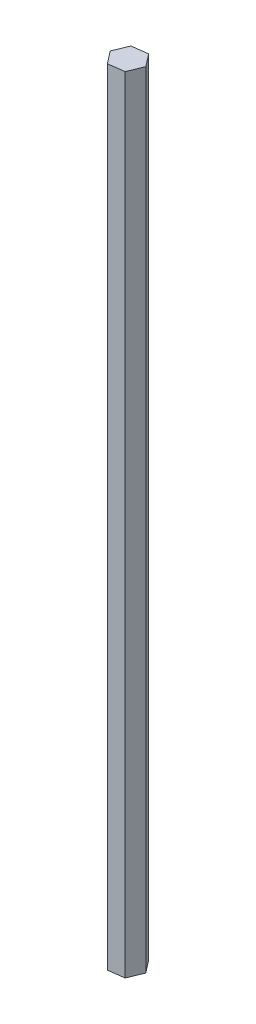
ISO-10303-21;
HEADER;
FILE_DESCRIPTION(('STEP AP214'),'2;1');
FILE_NAME('part.step','',(''),(''),'','','');
FILE_SCHEMA(('AUTOMOTIVE_DESIGN { 1 0 10303 214 1 1 1 1 }'));
ENDSEC;
DATA;
#1=APPLICATION_CONTEXT('core data for automotive mechanical design processes');
#2=APPLICATION_PROTOCOL_DEFINITION('international standard','automotive_design',2000,#1);
#3=PRODUCT_CONTEXT('',#1,'mechanical');
#4=PRODUCT('Part','Part','',(#3));
#5=PRODUCT_RELATED_PRODUCT_CATEGORY('part','',(#4));
#6=PRODUCT_DEFINITION_FORMATION('','',#4);
#7=PRODUCT_DEFINITION_CONTEXT('part definition',#1,'design');
#8=PRODUCT_DEFINITION('design','',#6,#7);
#9=PRODUCT_DEFINITION_SHAPE('','',#8);
#10=(LENGTH_UNIT() NAMED_UNIT(*) SI_UNIT(.MILLI.,.METRE.));
#11=(NAMED_UNIT(*) PLANE_ANGLE_UNIT() SI_UNIT($,.RADIAN.));
#12=(NAMED_UNIT(*) SI_UNIT($,.STERADIAN.) SOLID_ANGLE_UNIT());
#13=UNCERTAINTY_MEASURE_WITH_UNIT(LENGTH_MEASURE(1.E-05),#10,'distance_accuracy_value','');
#14=(GEOMETRIC_REPRESENTATION_CONTEXT(3) GLOBAL_UNCERTAINTY_ASSIGNED_CONTEXT((#13)) GLOBAL_UNIT_ASSIGNED_CONTEXT((#10,
#11,#12)) REPRESENTATION_CONTEXT('',''));
#15=CARTESIAN_POINT('',(0.,0.,0.));
#16=DIRECTION('',(0.,0.,1.));
#17=DIRECTION('',(1.,0.,0.));
#18=AXIS2_PLACEMENT_3D('',#15,#16,#17);
#19=CARTESIAN_POINT('',(-2.09007555438806,136.525,5.08659603044605));
#20=DIRECTION('',(-0.13333417843289,0.,-0.991071136125771));
#21=DIRECTION('',(-0.991071136125771,0.,0.13333417843289));
#22=AXIS2_PLACEMENT_3D('',#19,#20,#21);
#23=PLANE('',#22);
#24=DIRECTION('',(0.991071136125771,0.,-0.13333417843289));
#25=VECTOR('',#24,1.);
#26=CARTESIAN_POINT('',(-2.09007555438806,-136.525,5.08659603044605));
#27=LINE('',#26,#25);
#28=CARTESIAN_POINT('',(-2.09007555438806,-136.525,5.08659603044605));
#29=VERTEX_POINT('',#28);
#30=CARTESIAN_POINT('',(3.36008360396133,-136.525,4.35335654115192));
#31=VERTEX_POINT('',#30);
#32=EDGE_CURVE('E141',#29,#31,#27,.T.);
#33=ORIENTED_EDGE('',*,*,#32,.T.);
#34=DIRECTION('',(0.,-1.,0.));
#35=VECTOR('',#34,1.);
#36=CARTESIAN_POINT('',(3.36008360396133,136.525,4.35335654115192));
#37=LINE('',#36,#35);
#38=CARTESIAN_POINT('',(3.36008360396133,136.525,4.35335654115192));
#39=VERTEX_POINT('',#38);
#40=EDGE_CURVE('E11',#39,#31,#37,.T.);
#41=ORIENTED_EDGE('',*,*,#40,.F.);
#42=DIRECTION('',(0.991071136125771,0.,-0.13333417843289));
#43=VECTOR('',#42,1.);
#44=CARTESIAN_POINT('',(-2.09007555438806,136.525,5.08659603044605));
#45=LINE('',#44,#43);
#46=CARTESIAN_POINT('',(-2.09007555438806,136.525,5.08659603044605));
#47=VERTEX_POINT('',#46);
#48=EDGE_CURVE('E157',#47,#39,#45,.T.);
#49=ORIENTED_EDGE('',*,*,#48,.F.);
#50=DIRECTION('',(0.,-1.,0.));
#51=VECTOR('',#50,1.);
#52=CARTESIAN_POINT('',(-2.09007555438806,136.525,5.08659603044605));
#53=LINE('',#52,#51);
#54=EDGE_CURVE('E137',#47,#29,#53,.T.);
#55=ORIENTED_EDGE('',*,*,#54,.T.);
#56=EDGE_LOOP('',(#33,#41,#49,#55));
#57=FACE_BOUND('',#56,.T.);
#58=ADVANCED_FACE('F39',(#57),#23,.F.);
#59=CARTESIAN_POINT('',(3.36008360396133,136.525,4.35335654115192));
#60=DIRECTION('',(-0.924959870058868,0.,-0.380064782347276));
#61=DIRECTION('',(-0.380064782347276,0.,0.924959870058868));
#62=AXIS2_PLACEMENT_3D('',#59,#60,#61);
#63=PLANE('',#62);
#64=DIRECTION('',(0.380064782347276,0.,-0.924959870058868));
#65=VECTOR('',#64,1.);
#66=CARTESIAN_POINT('',(3.36008360396133,-136.525,4.35335654115192));
#67=LINE('',#66,#65);
#68=CARTESIAN_POINT('',(5.45015915834939,-136.525,-0.733239489294123));
#69=VERTEX_POINT('',#68);
#70=EDGE_CURVE('E145',#31,#69,#67,.T.);
#71=ORIENTED_EDGE('',*,*,#70,.T.);
#72=DIRECTION('',(0.,-1.,0.));
#73=VECTOR('',#72,1.);
#74=CARTESIAN_POINT('',(5.45015915834939,136.525,-0.733239489294123));
#75=LINE('',#74,#73);
#76=CARTESIAN_POINT('',(5.45015915834939,136.525,-0.733239489294123));
#77=VERTEX_POINT('',#76);
#78=EDGE_CURVE('E48',#77,#69,#75,.T.);
#79=ORIENTED_EDGE('',*,*,#78,.F.);
#80=DIRECTION('',(0.380064782347276,0.,-0.924959870058868));
#81=VECTOR('',#80,1.);
#82=CARTESIAN_POINT('',(3.36008360396133,136.525,4.35335654115192));
#83=LINE('',#82,#81);
#84=EDGE_CURVE('E104',#39,#77,#83,.T.);
#85=ORIENTED_EDGE('',*,*,#84,.F.);
#86=ORIENTED_EDGE('',*,*,#40,.T.);
#87=EDGE_LOOP('',(#71,#79,#85,#86));
#88=FACE_BOUND('',#87,.T.);
#89=ADVANCED_FACE('F184',(#88),#63,.F.);
#90=CARTESIAN_POINT('',(5.45015915834939,136.525,-0.733239489294123));
#91=DIRECTION('',(-0.791625691625978,0.,0.611006353778495));
#92=DIRECTION('',(0.611006353778495,0.,0.791625691625978));
#93=AXIS2_PLACEMENT_3D('',#90,#91,#92);
#94=PLANE('',#93);
#95=DIRECTION('',(-0.611006353778495,0.,-0.791625691625978));
#96=VECTOR('',#95,1.);
#97=CARTESIAN_POINT('',(5.45015915834939,-136.525,-0.733239489294123));
#98=LINE('',#97,#96);
#99=CARTESIAN_POINT('',(2.09007555438806,-136.525,-5.08659603044605));
#100=VERTEX_POINT('',#99);
#101=EDGE_CURVE('E148',#69,#100,#98,.T.);
#102=ORIENTED_EDGE('',*,*,#101,.T.);
#103=DIRECTION('',(0.,-1.,0.));
#104=VECTOR('',#103,1.);
#105=CARTESIAN_POINT('',(2.09007555438806,136.525,-5.08659603044605));
#106=LINE('',#105,#104);
#107=CARTESIAN_POINT('',(2.09007555438806,136.525,-5.08659603044605));
#108=VERTEX_POINT('',#107);
#109=EDGE_CURVE('E129',#108,#100,#106,.T.);
#110=ORIENTED_EDGE('',*,*,#109,.F.);
#111=DIRECTION('',(-0.611006353778495,0.,-0.791625691625978));
#112=VECTOR('',#111,1.);
#113=CARTESIAN_POINT('',(5.45015915834939,136.525,-0.733239489294123));
#114=LINE('',#113,#112);
#115=EDGE_CURVE('E118',#77,#108,#114,.T.);
#116=ORIENTED_EDGE('',*,*,#115,.F.);
#117=ORIENTED_EDGE('',*,*,#78,.T.);
#118=EDGE_LOOP('',(#102,#110,#116,#117));
#119=FACE_BOUND('',#118,.T.);
#120=ADVANCED_FACE('F166',(#119),#94,.F.);
#121=CARTESIAN_POINT('',(2.09007555438806,136.525,-5.08659603044605));
#122=DIRECTION('',(0.13333417843289,0.,0.991071136125771));
#123=DIRECTION('',(0.991071136125771,0.,-0.13333417843289));
#124=AXIS2_PLACEMENT_3D('',#121,#122,#123);
#125=PLANE('',#124);
#126=DIRECTION('',(-0.991071136125771,0.,0.13333417843289));
#127=VECTOR('',#126,1.);
#128=CARTESIAN_POINT('',(2.09007555438806,-136.525,-5.08659603044605));
#129=LINE('',#128,#127);
#130=CARTESIAN_POINT('',(-3.36008360396133,-136.525,-4.35335654115192));
#131=VERTEX_POINT('',#130);
#132=EDGE_CURVE('E127',#100,#131,#129,.T.);
#133=ORIENTED_EDGE('',*,*,#132,.T.);
#134=DIRECTION('',(0.,-1.,0.));
#135=VECTOR('',#134,1.);
#136=CARTESIAN_POINT('',(-3.36008360396133,136.525,-4.35335654115192));
#137=LINE('',#136,#135);
#138=CARTESIAN_POINT('',(-3.36008360396133,136.525,-4.35335654115192));
#139=VERTEX_POINT('',#138);
#140=EDGE_CURVE('E124',#139,#131,#137,.T.);
#141=ORIENTED_EDGE('',*,*,#140,.F.);
#142=DIRECTION('',(-0.991071136125771,0.,0.13333417843289));
#143=VECTOR('',#142,1.);
#144=CARTESIAN_POINT('',(2.09007555438806,136.525,-5.08659603044605));
#145=LINE('',#144,#143);
#146=EDGE_CURVE('E112',#108,#139,#145,.T.);
#147=ORIENTED_EDGE('',*,*,#146,.F.);
#148=ORIENTED_EDGE('',*,*,#109,.T.);
#149=EDGE_LOOP('',(#133,#141,#147,#148));
#150=FACE_BOUND('',#149,.T.);
#151=ADVANCED_FACE('F125',(#150),#125,.F.);
#152=CARTESIAN_POINT('',(-3.36008360396133,136.525,-4.35335654115192));
#153=DIRECTION('',(0.924959870058868,0.,0.380064782347275));
#154=DIRECTION('',(0.380064782347275,0.,-0.924959870058868));
#155=AXIS2_PLACEMENT_3D('',#152,#153,#154);
#156=PLANE('',#155);
#157=DIRECTION('',(-0.380064782347275,0.,0.924959870058868));
#158=VECTOR('',#157,1.);
#159=CARTESIAN_POINT('',(-3.36008360396133,-136.525,-4.35335654115192));
#160=LINE('',#159,#158);
#161=CARTESIAN_POINT('',(-5.45015915834939,-136.525,0.733239489294122));
#162=VERTEX_POINT('',#161);
#163=EDGE_CURVE('E88',#131,#162,#160,.T.);
#164=ORIENTED_EDGE('',*,*,#163,.T.);
#165=DIRECTION('',(0.,-1.,0.));
#166=VECTOR('',#165,1.);
#167=CARTESIAN_POINT('',(-5.45015915834939,136.525,0.733239489294122));
#168=LINE('',#167,#166);
#169=CARTESIAN_POINT('',(-5.45015915834939,136.525,0.733239489294122));
#170=VERTEX_POINT('',#169);
#171=EDGE_CURVE('E130',#170,#162,#168,.T.);
#172=ORIENTED_EDGE('',*,*,#171,.F.);
#173=DIRECTION('',(-0.380064782347275,0.,0.924959870058868));
#174=VECTOR('',#173,1.);
#175=CARTESIAN_POINT('',(-3.36008360396133,136.525,-4.35335654115192));
#176=LINE('',#175,#174);
#177=EDGE_CURVE('E116',#139,#170,#176,.T.);
#178=ORIENTED_EDGE('',*,*,#177,.F.);
#179=ORIENTED_EDGE('',*,*,#140,.T.);
#180=EDGE_LOOP('',(#164,#172,#178,#179));
#181=FACE_BOUND('',#180,.T.);
#182=ADVANCED_FACE('F132',(#181),#156,.F.);
#183=CARTESIAN_POINT('',(-5.45015915834939,136.525,0.733239489294122));
#184=DIRECTION('',(0.791625691625978,0.,-0.611006353778495));
#185=DIRECTION('',(-0.611006353778495,0.,-0.791625691625978));
#186=AXIS2_PLACEMENT_3D('',#183,#184,#185);
#187=PLANE('',#186);
#188=DIRECTION('',(0.611006353778495,0.,0.791625691625978));
#189=VECTOR('',#188,1.);
#190=CARTESIAN_POINT('',(-5.45015915834939,-136.525,0.733239489294122));
#191=LINE('',#190,#189);
#192=EDGE_CURVE('E94',#162,#29,#191,.T.);
#193=ORIENTED_EDGE('',*,*,#192,.T.);
#194=ORIENTED_EDGE('',*,*,#54,.F.);
#195=DIRECTION('',(0.611006353778495,0.,0.791625691625978));
#196=VECTOR('',#195,1.);
#197=CARTESIAN_POINT('',(-5.45015915834939,136.525,0.733239489294122));
#198=LINE('',#197,#196);
#199=EDGE_CURVE('E59',#170,#47,#198,.T.);
#200=ORIENTED_EDGE('',*,*,#199,.F.);
#201=ORIENTED_EDGE('',*,*,#171,.T.);
#202=EDGE_LOOP('',(#193,#194,#200,#201));
#203=FACE_BOUND('',#202,.T.);
#204=ADVANCED_FACE('F173',(#203),#187,.F.);
#205=CARTESIAN_POINT('',(0.,136.525,0.));
#206=DIRECTION('',(0.,1.,0.));
#207=DIRECTION('',(0.,0.,1.));
#208=AXIS2_PLACEMENT_3D('',#205,#206,#207);
#209=PLANE('',#208);
#210=ORIENTED_EDGE('',*,*,#48,.T.);
#211=ORIENTED_EDGE('',*,*,#84,.T.);
#212=ORIENTED_EDGE('',*,*,#115,.T.);
#213=ORIENTED_EDGE('',*,*,#146,.T.);
#214=ORIENTED_EDGE('',*,*,#177,.T.);
#215=ORIENTED_EDGE('',*,*,#199,.T.);
#216=EDGE_LOOP('',(#210,#211,#212,#213,#214,#215));
#217=FACE_BOUND('',#216,.T.);
#218=ADVANCED_FACE('F114',(#217),#209,.T.);
#219=CARTESIAN_POINT('',(0.,-136.525,0.));
#220=DIRECTION('',(0.,1.,0.));
#221=DIRECTION('',(0.,0.,1.));
#222=AXIS2_PLACEMENT_3D('',#219,#220,#221);
#223=PLANE('',#222);
#224=ORIENTED_EDGE('',*,*,#32,.F.);
#225=ORIENTED_EDGE('',*,*,#192,.F.);
#226=ORIENTED_EDGE('',*,*,#163,.F.);
#227=ORIENTED_EDGE('',*,*,#132,.F.);
#228=ORIENTED_EDGE('',*,*,#101,.F.);
#229=ORIENTED_EDGE('',*,*,#70,.F.);
#230=EDGE_LOOP('',(#224,#225,#226,#227,#228,#229));
#231=FACE_BOUND('',#230,.T.);
#232=ADVANCED_FACE('F169',(#231),#223,.F.);
#233=CLOSED_SHELL('',(#58,#89,#120,#151,#182,#204,#218,#232));
#234=MANIFOLD_SOLID_BREP('B2',#233);
#235=ADVANCED_BREP_SHAPE_REPRESENTATION('',(#18,#234),#14);
#236=SHAPE_DEFINITION_REPRESENTATION(#9,#235);
ENDSEC;
END-ISO-10303-21;
